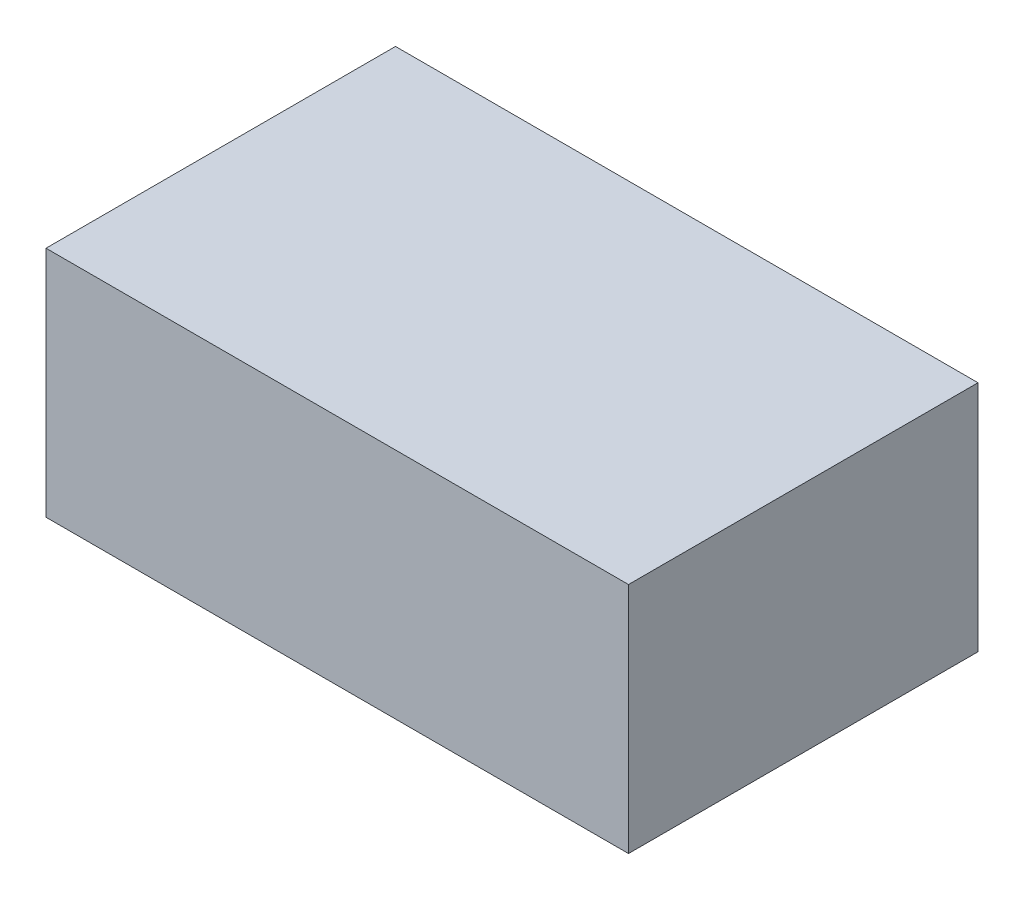
ISO-10303-21;
HEADER;
FILE_DESCRIPTION(('STEP AP214'),'2;1');
FILE_NAME('part.step','',(''),(''),'','','');
FILE_SCHEMA(('AUTOMOTIVE_DESIGN { 1 0 10303 214 1 1 1 1 }'));
ENDSEC;
DATA;
#1=APPLICATION_CONTEXT('core data for automotive mechanical design processes');
#2=APPLICATION_PROTOCOL_DEFINITION('international standard','automotive_design',2000,#1);
#3=PRODUCT_CONTEXT('',#1,'mechanical');
#4=PRODUCT('Part','Part','',(#3));
#5=PRODUCT_RELATED_PRODUCT_CATEGORY('part','',(#4));
#6=PRODUCT_DEFINITION_FORMATION('','',#4);
#7=PRODUCT_DEFINITION_CONTEXT('part definition',#1,'design');
#8=PRODUCT_DEFINITION('design','',#6,#7);
#9=PRODUCT_DEFINITION_SHAPE('','',#8);
#10=(LENGTH_UNIT() NAMED_UNIT(*) SI_UNIT(.MILLI.,.METRE.));
#11=(NAMED_UNIT(*) PLANE_ANGLE_UNIT() SI_UNIT($,.RADIAN.));
#12=(NAMED_UNIT(*) SI_UNIT($,.STERADIAN.) SOLID_ANGLE_UNIT());
#13=UNCERTAINTY_MEASURE_WITH_UNIT(LENGTH_MEASURE(1.E-05),#10,'distance_accuracy_value','');
#14=(GEOMETRIC_REPRESENTATION_CONTEXT(3) GLOBAL_UNCERTAINTY_ASSIGNED_CONTEXT((#13)) GLOBAL_UNIT_ASSIGNED_CONTEXT((#10,
#11,#12)) REPRESENTATION_CONTEXT('',''));
#15=CARTESIAN_POINT('',(0.,0.,0.));
#16=DIRECTION('',(0.,0.,1.));
#17=DIRECTION('',(1.,0.,0.));
#18=AXIS2_PLACEMENT_3D('',#15,#16,#17);
#19=CARTESIAN_POINT('',(127.,101.6,-76.2));
#20=DIRECTION('',(-1.,0.,0.));
#21=DIRECTION('',(0.,0.,1.));
#22=AXIS2_PLACEMENT_3D('',#19,#20,#21);
#23=PLANE('',#22);
#24=DIRECTION('',(0.,0.,-1.));
#25=VECTOR('',#24,1.);
#26=CARTESIAN_POINT('',(127.,0.,-76.2));
#27=LINE('',#26,#25);
#28=CARTESIAN_POINT('',(127.,0.,76.2));
#29=VERTEX_POINT('',#28);
#30=CARTESIAN_POINT('',(127.,0.,-76.2));
#31=VERTEX_POINT('',#30);
#32=EDGE_CURVE('E96',#29,#31,#27,.T.);
#33=ORIENTED_EDGE('',*,*,#32,.T.);
#34=DIRECTION('',(0.,-1.,0.));
#35=VECTOR('',#34,1.);
#36=CARTESIAN_POINT('',(127.,101.6,-76.2));
#37=LINE('',#36,#35);
#38=CARTESIAN_POINT('',(127.,101.6,-76.2));
#39=VERTEX_POINT('',#38);
#40=EDGE_CURVE('E11',#39,#31,#37,.T.);
#41=ORIENTED_EDGE('',*,*,#40,.F.);
#42=DIRECTION('',(0.,0.,-1.));
#43=VECTOR('',#42,1.);
#44=CARTESIAN_POINT('',(127.,101.6,-76.2));
#45=LINE('',#44,#43);
#46=CARTESIAN_POINT('',(127.,101.6,76.2));
#47=VERTEX_POINT('',#46);
#48=EDGE_CURVE('E84',#47,#39,#45,.T.);
#49=ORIENTED_EDGE('',*,*,#48,.F.);
#50=DIRECTION('',(0.,-1.,0.));
#51=VECTOR('',#50,1.);
#52=CARTESIAN_POINT('',(127.,101.6,76.2));
#53=LINE('',#52,#51);
#54=EDGE_CURVE('E92',#47,#29,#53,.T.);
#55=ORIENTED_EDGE('',*,*,#54,.T.);
#56=EDGE_LOOP('',(#33,#41,#49,#55));
#57=FACE_BOUND('',#56,.T.);
#58=ADVANCED_FACE('F33',(#57),#23,.F.);
#59=CARTESIAN_POINT('',(-127.,101.6,-76.2));
#60=DIRECTION('',(0.,0.,1.));
#61=DIRECTION('',(1.,0.,0.));
#62=AXIS2_PLACEMENT_3D('',#59,#60,#61);
#63=PLANE('',#62);
#64=DIRECTION('',(-1.,0.,0.));
#65=VECTOR('',#64,1.);
#66=CARTESIAN_POINT('',(-127.,0.,-76.2));
#67=LINE('',#66,#65);
#68=CARTESIAN_POINT('',(-127.,0.,-76.2));
#69=VERTEX_POINT('',#68);
#70=EDGE_CURVE('E88',#31,#69,#67,.T.);
#71=ORIENTED_EDGE('',*,*,#70,.T.);
#72=DIRECTION('',(0.,-1.,0.));
#73=VECTOR('',#72,1.);
#74=CARTESIAN_POINT('',(-127.,101.6,-76.2));
#75=LINE('',#74,#73);
#76=CARTESIAN_POINT('',(-127.,101.6,-76.2));
#77=VERTEX_POINT('',#76);
#78=EDGE_CURVE('E41',#77,#69,#75,.T.);
#79=ORIENTED_EDGE('',*,*,#78,.F.);
#80=DIRECTION('',(-1.,0.,0.));
#81=VECTOR('',#80,1.);
#82=CARTESIAN_POINT('',(-127.,101.6,-76.2));
#83=LINE('',#82,#81);
#84=EDGE_CURVE('E79',#39,#77,#83,.T.);
#85=ORIENTED_EDGE('',*,*,#84,.F.);
#86=ORIENTED_EDGE('',*,*,#40,.T.);
#87=EDGE_LOOP('',(#71,#79,#85,#86));
#88=FACE_BOUND('',#87,.T.);
#89=ADVANCED_FACE('F87',(#88),#63,.F.);
#90=CARTESIAN_POINT('',(-127.,101.6,-76.2));
#91=DIRECTION('',(1.,0.,0.));
#92=DIRECTION('',(0.,0.,-1.));
#93=AXIS2_PLACEMENT_3D('',#90,#91,#92);
#94=PLANE('',#93);
#95=DIRECTION('',(0.,0.,1.));
#96=VECTOR('',#95,1.);
#97=CARTESIAN_POINT('',(-127.,0.,-76.2));
#98=LINE('',#97,#96);
#99=CARTESIAN_POINT('',(-127.,0.,76.2));
#100=VERTEX_POINT('',#99);
#101=EDGE_CURVE('E66',#69,#100,#98,.T.);
#102=ORIENTED_EDGE('',*,*,#101,.T.);
#103=DIRECTION('',(0.,-1.,0.));
#104=VECTOR('',#103,1.);
#105=CARTESIAN_POINT('',(-127.,101.6,76.2));
#106=LINE('',#105,#104);
#107=CARTESIAN_POINT('',(-127.,101.6,76.2));
#108=VERTEX_POINT('',#107);
#109=EDGE_CURVE('E89',#108,#100,#106,.T.);
#110=ORIENTED_EDGE('',*,*,#109,.F.);
#111=DIRECTION('',(0.,0.,1.));
#112=VECTOR('',#111,1.);
#113=CARTESIAN_POINT('',(-127.,101.6,-76.2));
#114=LINE('',#113,#112);
#115=EDGE_CURVE('E82',#77,#108,#114,.T.);
#116=ORIENTED_EDGE('',*,*,#115,.F.);
#117=ORIENTED_EDGE('',*,*,#78,.T.);
#118=EDGE_LOOP('',(#102,#110,#116,#117));
#119=FACE_BOUND('',#118,.T.);
#120=ADVANCED_FACE('F90',(#119),#94,.F.);
#121=CARTESIAN_POINT('',(-127.,101.6,76.2));
#122=DIRECTION('',(0.,0.,-1.));
#123=DIRECTION('',(-1.,0.,0.));
#124=AXIS2_PLACEMENT_3D('',#121,#122,#123);
#125=PLANE('',#124);
#126=DIRECTION('',(1.,0.,0.));
#127=VECTOR('',#126,1.);
#128=CARTESIAN_POINT('',(-127.,0.,76.2));
#129=LINE('',#128,#127);
#130=EDGE_CURVE('E72',#100,#29,#129,.T.);
#131=ORIENTED_EDGE('',*,*,#130,.T.);
#132=ORIENTED_EDGE('',*,*,#54,.F.);
#133=DIRECTION('',(1.,0.,0.));
#134=VECTOR('',#133,1.);
#135=CARTESIAN_POINT('',(-127.,101.6,76.2));
#136=LINE('',#135,#134);
#137=EDGE_CURVE('E49',#108,#47,#136,.T.);
#138=ORIENTED_EDGE('',*,*,#137,.F.);
#139=ORIENTED_EDGE('',*,*,#109,.T.);
#140=EDGE_LOOP('',(#131,#132,#138,#139));
#141=FACE_BOUND('',#140,.T.);
#142=ADVANCED_FACE('F103',(#141),#125,.F.);
#143=CARTESIAN_POINT('',(0.,101.6,0.));
#144=DIRECTION('',(0.,1.,0.));
#145=DIRECTION('',(0.,0.,1.));
#146=AXIS2_PLACEMENT_3D('',#143,#144,#145);
#147=PLANE('',#146);
#148=ORIENTED_EDGE('',*,*,#48,.T.);
#149=ORIENTED_EDGE('',*,*,#84,.T.);
#150=ORIENTED_EDGE('',*,*,#115,.T.);
#151=ORIENTED_EDGE('',*,*,#137,.T.);
#152=EDGE_LOOP('',(#148,#149,#150,#151));
#153=FACE_BOUND('',#152,.T.);
#154=ADVANCED_FACE('F80',(#153),#147,.T.);
#155=CARTESIAN_POINT('',(0.,0.,0.));
#156=DIRECTION('',(0.,1.,0.));
#157=DIRECTION('',(0.,0.,1.));
#158=AXIS2_PLACEMENT_3D('',#155,#156,#157);
#159=PLANE('',#158);
#160=ORIENTED_EDGE('',*,*,#32,.F.);
#161=ORIENTED_EDGE('',*,*,#130,.F.);
#162=ORIENTED_EDGE('',*,*,#101,.F.);
#163=ORIENTED_EDGE('',*,*,#70,.F.);
#164=EDGE_LOOP('',(#160,#161,#162,#163));
#165=FACE_BOUND('',#164,.T.);
#166=ADVANCED_FACE('F106',(#165),#159,.F.);
#167=CLOSED_SHELL('',(#58,#89,#120,#142,#154,#166));
#168=MANIFOLD_SOLID_BREP('B2',#167);
#169=ADVANCED_BREP_SHAPE_REPRESENTATION('',(#18,#168),#14);
#170=SHAPE_DEFINITION_REPRESENTATION(#9,#169);
ENDSEC;
END-ISO-10303-21;
